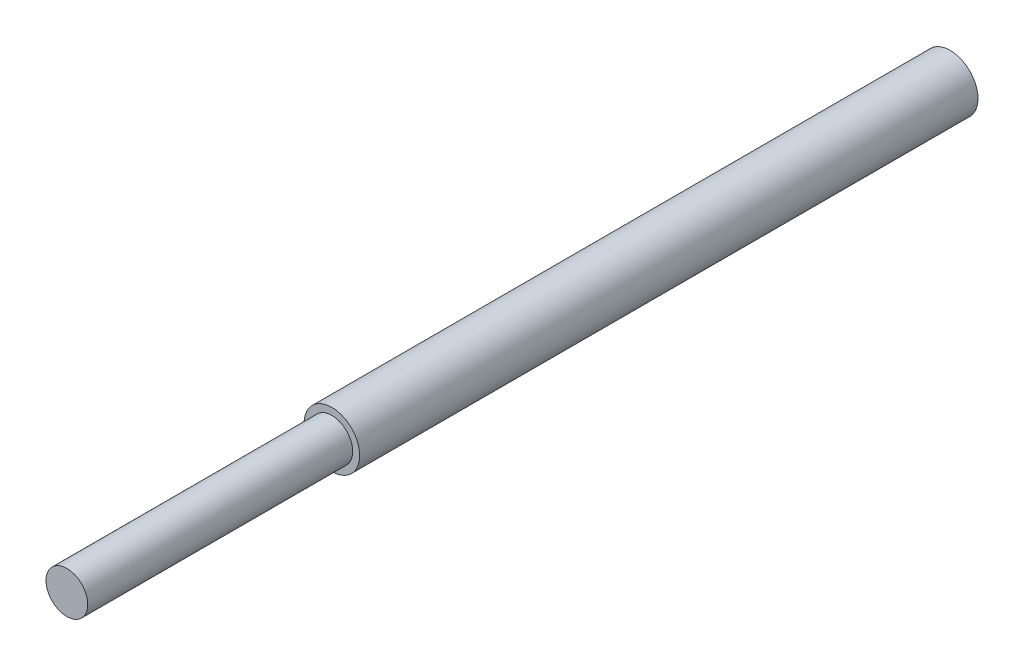
ISO-10303-21;
HEADER;
FILE_DESCRIPTION(('STEP AP214'),'2;1');
FILE_NAME('part.step','',(''),(''),'','','');
FILE_SCHEMA(('AUTOMOTIVE_DESIGN { 1 0 10303 214 1 1 1 1 }'));
ENDSEC;
DATA;
#1=APPLICATION_CONTEXT('core data for automotive mechanical design processes');
#2=APPLICATION_PROTOCOL_DEFINITION('international standard','automotive_design',2000,#1);
#3=PRODUCT_CONTEXT('',#1,'mechanical');
#4=PRODUCT('Part','Part','',(#3));
#5=PRODUCT_RELATED_PRODUCT_CATEGORY('part','',(#4));
#6=PRODUCT_DEFINITION_FORMATION('','',#4);
#7=PRODUCT_DEFINITION_CONTEXT('part definition',#1,'design');
#8=PRODUCT_DEFINITION('design','',#6,#7);
#9=PRODUCT_DEFINITION_SHAPE('','',#8);
#10=(LENGTH_UNIT() NAMED_UNIT(*) SI_UNIT(.MILLI.,.METRE.));
#11=(NAMED_UNIT(*) PLANE_ANGLE_UNIT() SI_UNIT($,.RADIAN.));
#12=(NAMED_UNIT(*) SI_UNIT($,.STERADIAN.) SOLID_ANGLE_UNIT());
#13=UNCERTAINTY_MEASURE_WITH_UNIT(LENGTH_MEASURE(1.E-05),#10,'distance_accuracy_value','');
#14=(GEOMETRIC_REPRESENTATION_CONTEXT(3) GLOBAL_UNCERTAINTY_ASSIGNED_CONTEXT((#13)) GLOBAL_UNIT_ASSIGNED_CONTEXT((#10,
#11,#12)) REPRESENTATION_CONTEXT('',''));
#15=CARTESIAN_POINT('',(0.,0.,0.));
#16=DIRECTION('',(0.,0.,1.));
#17=DIRECTION('',(1.,0.,0.));
#18=AXIS2_PLACEMENT_3D('',#15,#16,#17);
#19=CARTESIAN_POINT('',(0.,0.,88.9));
#20=DIRECTION('',(0.,0.,-1.));
#21=DIRECTION('',(-1.,0.,0.));
#22=AXIS2_PLACEMENT_3D('',#19,#20,#21);
#23=CYLINDRICAL_SURFACE('',#22,4.);
#24=CARTESIAN_POINT('',(0.,0.,88.9));
#25=DIRECTION('',(0.,0.,1.));
#26=DIRECTION('',(1.,0.,0.));
#27=AXIS2_PLACEMENT_3D('',#24,#25,#26);
#28=CIRCLE('',#27,4.);
#29=CARTESIAN_POINT('',(4.,0.,88.9));
#30=VERTEX_POINT('',#29);
#31=EDGE_CURVE('E45',#30,#30,#28,.T.);
#32=ORIENTED_EDGE('',*,*,#31,.F.);
#33=EDGE_LOOP('',(#32));
#34=FACE_BOUND('',#33,.T.);
#35=CARTESIAN_POINT('',(0.,0.,0.));
#36=DIRECTION('',(0.,0.,1.));
#37=DIRECTION('',(1.,0.,0.));
#38=AXIS2_PLACEMENT_3D('',#35,#36,#37);
#39=CIRCLE('',#38,4.);
#40=CARTESIAN_POINT('',(4.,0.,0.));
#41=VERTEX_POINT('',#40);
#42=EDGE_CURVE('E40',#41,#41,#39,.T.);
#43=ORIENTED_EDGE('',*,*,#42,.T.);
#44=EDGE_LOOP('',(#43));
#45=FACE_BOUND('',#44,.T.);
#46=ADVANCED_FACE('F37',(#34,#45),#23,.T.);
#47=CARTESIAN_POINT('',(0.,0.,88.9));
#48=DIRECTION('',(0.,0.,1.));
#49=DIRECTION('',(1.,0.,0.));
#50=AXIS2_PLACEMENT_3D('',#47,#48,#49);
#51=PLANE('',#50);
#52=CARTESIAN_POINT('',(0.,0.,88.9));
#53=DIRECTION('',(0.,0.,1.));
#54=DIRECTION('',(1.,0.,0.));
#55=AXIS2_PLACEMENT_3D('',#52,#53,#54);
#56=CIRCLE('',#55,3.);
#57=CARTESIAN_POINT('',(-3.,0.,88.9));
#58=VERTEX_POINT('',#57);
#59=EDGE_CURVE('E10',#58,#58,#56,.T.);
#60=ORIENTED_EDGE('',*,*,#59,.F.);
#61=EDGE_LOOP('',(#60));
#62=FACE_BOUND('',#61,.T.);
#63=ORIENTED_EDGE('',*,*,#31,.T.);
#64=EDGE_LOOP('',(#63));
#65=FACE_BOUND('',#64,.T.);
#66=ADVANCED_FACE('F65',(#62,#65),#51,.T.);
#67=CARTESIAN_POINT('',(0.,0.,0.));
#68=DIRECTION('',(0.,0.,1.));
#69=DIRECTION('',(1.,0.,0.));
#70=AXIS2_PLACEMENT_3D('',#67,#68,#69);
#71=PLANE('',#70);
#72=ORIENTED_EDGE('',*,*,#42,.F.);
#73=EDGE_LOOP('',(#72));
#74=FACE_BOUND('',#73,.T.);
#75=ADVANCED_FACE('F62',(#74),#71,.F.);
#76=CARTESIAN_POINT('',(0.,0.,127.));
#77=DIRECTION('',(0.,0.,-1.));
#78=DIRECTION('',(-1.,0.,0.));
#79=AXIS2_PLACEMENT_3D('',#76,#77,#78);
#80=CYLINDRICAL_SURFACE('',#79,3.);
#81=CARTESIAN_POINT('',(0.,0.,127.));
#82=DIRECTION('',(0.,0.,1.));
#83=DIRECTION('',(1.,0.,0.));
#84=AXIS2_PLACEMENT_3D('',#81,#82,#83);
#85=CIRCLE('',#84,3.);
#86=CARTESIAN_POINT('',(-3.,0.,127.));
#87=VERTEX_POINT('',#86);
#88=EDGE_CURVE('E52',#87,#87,#85,.T.);
#89=CARTESIAN_POINT('',(-3.,0.,127.));
#90=CARTESIAN_POINT('',(-3.,0.,126.603125));
#91=CARTESIAN_POINT('',(-3.,0.,126.20625));
#92=CARTESIAN_POINT('',(-3.,0.,125.4125));
#93=CARTESIAN_POINT('',(-3.,0.,125.015625));
#94=CARTESIAN_POINT('',(-3.,0.,124.221875));
#95=CARTESIAN_POINT('',(-3.,0.,123.825));
#96=CARTESIAN_POINT('',(-3.,0.,123.03125));
#97=CARTESIAN_POINT('',(-3.,0.,122.634375));
#98=CARTESIAN_POINT('',(-3.,0.,121.840625));
#99=CARTESIAN_POINT('',(-3.,0.,121.44375));
#100=CARTESIAN_POINT('',(-3.,0.,120.65));
#101=CARTESIAN_POINT('',(-3.,0.,120.253125));
#102=CARTESIAN_POINT('',(-3.,0.,119.459375));
#103=CARTESIAN_POINT('',(-3.,0.,119.0625));
#104=CARTESIAN_POINT('',(-3.,0.,118.26875));
#105=CARTESIAN_POINT('',(-3.,0.,117.871875));
#106=CARTESIAN_POINT('',(-3.,0.,117.078125));
#107=CARTESIAN_POINT('',(-3.,0.,116.68125));
#108=CARTESIAN_POINT('',(-3.,0.,115.8875));
#109=CARTESIAN_POINT('',(-3.,0.,115.490625));
#110=CARTESIAN_POINT('',(-3.,0.,114.696875));
#111=CARTESIAN_POINT('',(-3.,0.,114.3));
#112=CARTESIAN_POINT('',(-3.,0.,113.50625));
#113=CARTESIAN_POINT('',(-3.,0.,113.109375));
#114=CARTESIAN_POINT('',(-3.,0.,112.315625));
#115=CARTESIAN_POINT('',(-3.,0.,111.91875));
#116=CARTESIAN_POINT('',(-3.,0.,111.125));
#117=CARTESIAN_POINT('',(-3.,0.,110.728125));
#118=CARTESIAN_POINT('',(-3.,0.,109.934375));
#119=CARTESIAN_POINT('',(-3.,0.,109.5375));
#120=CARTESIAN_POINT('',(-3.,0.,108.74375));
#121=CARTESIAN_POINT('',(-3.,0.,108.346875));
#122=CARTESIAN_POINT('',(-3.,0.,107.553125));
#123=CARTESIAN_POINT('',(-3.,0.,107.15625));
#124=CARTESIAN_POINT('',(-3.,0.,106.3625));
#125=CARTESIAN_POINT('',(-3.,0.,105.965625));
#126=CARTESIAN_POINT('',(-3.,0.,105.171875));
#127=CARTESIAN_POINT('',(-3.,0.,104.775));
#128=CARTESIAN_POINT('',(-3.,0.,103.98125));
#129=CARTESIAN_POINT('',(-3.,0.,103.584375));
#130=CARTESIAN_POINT('',(-3.,0.,102.790625));
#131=CARTESIAN_POINT('',(-3.,0.,102.39375));
#132=CARTESIAN_POINT('',(-3.,0.,101.6));
#133=CARTESIAN_POINT('',(-3.,0.,101.203125));
#134=CARTESIAN_POINT('',(-3.,0.,100.409375));
#135=CARTESIAN_POINT('',(-3.,0.,100.0125));
#136=CARTESIAN_POINT('',(-3.,0.,99.21875));
#137=CARTESIAN_POINT('',(-3.,0.,98.821875));
#138=CARTESIAN_POINT('',(-3.,0.,98.028125));
#139=CARTESIAN_POINT('',(-3.,0.,97.63125));
#140=CARTESIAN_POINT('',(-3.,0.,96.8375));
#141=CARTESIAN_POINT('',(-3.,0.,96.440625));
#142=CARTESIAN_POINT('',(-3.,0.,95.646875));
#143=CARTESIAN_POINT('',(-3.,0.,95.25));
#144=CARTESIAN_POINT('',(-3.,0.,94.45625));
#145=CARTESIAN_POINT('',(-3.,0.,94.059375));
#146=CARTESIAN_POINT('',(-3.,0.,93.265625));
#147=CARTESIAN_POINT('',(-3.,0.,92.86875));
#148=CARTESIAN_POINT('',(-3.,0.,92.075));
#149=CARTESIAN_POINT('',(-3.,0.,91.678125));
#150=CARTESIAN_POINT('',(-3.,0.,90.884375));
#151=CARTESIAN_POINT('',(-3.,0.,90.4875));
#152=CARTESIAN_POINT('',(-3.,0.,89.69375));
#153=CARTESIAN_POINT('',(-3.,0.,89.296875));
#154=CARTESIAN_POINT('',(-3.,0.,88.9));
#155=B_SPLINE_CURVE_WITH_KNOTS('',3,(#89,#90,#91,#92,#93,#94,#95,#96,#97,#98,#99,#100,#101,#102,
#103,#104,#105,#106,#107,#108,#109,#110,#111,#112,#113,#114,#115,#116,#117,#118,#119,#120,#121,
#122,#123,#124,#125,#126,#127,#128,#129,#130,#131,#132,#133,#134,#135,#136,#137,#138,#139,#140,
#141,#142,#143,#144,#145,#146,#147,#148,#149,#150,#151,#152,#153,#154),.UNSPECIFIED.,.F.,.F.,(4,
2,2,2,2,2,2,2,2,2,2,2,2,2,2,2,2,2,2,2,2,2,2,2,2,2,2,2,2,2,2,2,4),(0.,1.19062499999997,
2.38124999999999,3.57187499999999,4.76249999999999,5.95312499999999,7.14374999999999,
8.33437499999999,9.52499999999999,10.715625,11.90625,13.096875,14.2875,15.478125,16.66875,
17.859375,19.05,20.240625,21.43125,22.621875,23.8125,25.003125,26.19375,27.384375,28.575,
29.765625,30.95625,32.146875,33.3375,34.528125,35.71875,36.909375,38.1),.UNSPECIFIED.);
#156=EDGE_CURVE('BSEAM64',#87,#58,#155,.T.);
#157=ORIENTED_EDGE('',*,*,#88,.F.);
#158=ORIENTED_EDGE('',*,*,#59,.T.);
#159=ORIENTED_EDGE('',*,*,#156,.T.);
#160=ORIENTED_EDGE('',*,*,#156,.F.);
#161=EDGE_LOOP('',(#157,#159,#158,#160));
#162=FACE_BOUND('',#161,.T.);
#163=ADVANCED_FACE('F64',(#162),#80,.T.);
#164=CARTESIAN_POINT('',(0.,0.,127.));
#165=DIRECTION('',(0.,0.,1.));
#166=DIRECTION('',(1.,0.,0.));
#167=AXIS2_PLACEMENT_3D('',#164,#165,#166);
#168=PLANE('',#167);
#169=ORIENTED_EDGE('',*,*,#88,.T.);
#170=EDGE_LOOP('',(#169));
#171=FACE_BOUND('',#170,.T.);
#172=ADVANCED_FACE('F70',(#171),#168,.T.);
#173=CLOSED_SHELL('',(#46,#66,#75,#163,#172));
#174=MANIFOLD_SOLID_BREP('B2',#173);
#175=ADVANCED_BREP_SHAPE_REPRESENTATION('',(#18,#174),#14);
#176=SHAPE_DEFINITION_REPRESENTATION(#9,#175);
ENDSEC;
END-ISO-10303-21;
